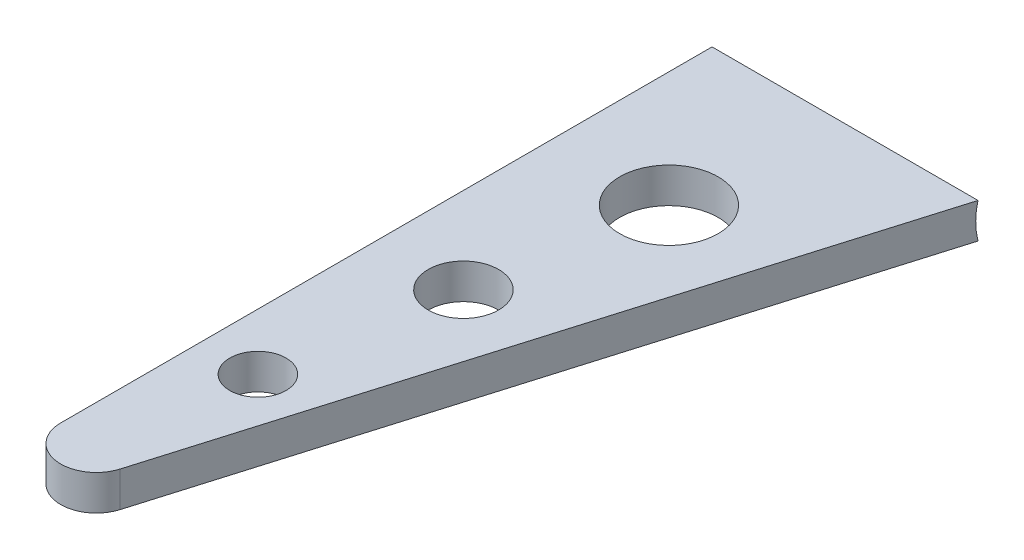
ISO-10303-21;
HEADER;
FILE_DESCRIPTION(('STEP AP214'),'2;1');
FILE_NAME('part.step','',(''),(''),'','','');
FILE_SCHEMA(('AUTOMOTIVE_DESIGN { 1 0 10303 214 1 1 1 1 }'));
ENDSEC;
DATA;
#1=APPLICATION_CONTEXT('core data for automotive mechanical design processes');
#2=APPLICATION_PROTOCOL_DEFINITION('international standard','automotive_design',2000,#1);
#3=PRODUCT_CONTEXT('',#1,'mechanical');
#4=PRODUCT('Part','Part','',(#3));
#5=PRODUCT_RELATED_PRODUCT_CATEGORY('part','',(#4));
#6=PRODUCT_DEFINITION_FORMATION('','',#4);
#7=PRODUCT_DEFINITION_CONTEXT('part definition',#1,'design');
#8=PRODUCT_DEFINITION('design','',#6,#7);
#9=PRODUCT_DEFINITION_SHAPE('','',#8);
#10=(LENGTH_UNIT() NAMED_UNIT(*) SI_UNIT(.MILLI.,.METRE.));
#11=(NAMED_UNIT(*) PLANE_ANGLE_UNIT() SI_UNIT($,.RADIAN.));
#12=(NAMED_UNIT(*) SI_UNIT($,.STERADIAN.) SOLID_ANGLE_UNIT());
#13=UNCERTAINTY_MEASURE_WITH_UNIT(LENGTH_MEASURE(1.E-05),#10,'distance_accuracy_value','');
#14=(GEOMETRIC_REPRESENTATION_CONTEXT(3) GLOBAL_UNCERTAINTY_ASSIGNED_CONTEXT((#13)) GLOBAL_UNIT_ASSIGNED_CONTEXT((#10,
#11,#12)) REPRESENTATION_CONTEXT('',''));
#15=CARTESIAN_POINT('',(0.,0.,0.));
#16=DIRECTION('',(0.,0.,1.));
#17=DIRECTION('',(1.,0.,0.));
#18=AXIS2_PLACEMENT_3D('',#15,#16,#17);
#19=CARTESIAN_POINT('',(5.05247252478177,5.,100.));
#20=DIRECTION('',(0.,1.,0.));
#21=DIRECTION('',(0.,0.,1.));
#22=AXIS2_PLACEMENT_3D('',#19,#20,#21);
#23=PLANE('',#22);
#24=DIRECTION('',(-1.,0.,0.));
#25=VECTOR('',#24,1.);
#26=CARTESIAN_POINT('',(50.,5.,7.45150593301871));
#27=LINE('',#26,#25);
#28=CARTESIAN_POINT('',(0.,5.,7.4515059330187));
#29=VERTEX_POINT('',#28);
#30=CARTESIAN_POINT('',(37.7885976695773,5.,7.45150593301878));
#31=VERTEX_POINT('',#30);
#32=EDGE_CURVE('E55',#29,#31,#27,.F.);
#33=ORIENTED_EDGE('',*,*,#32,.F.);
#34=DIRECTION('',(0.,0.,1.));
#35=VECTOR('',#34,1.);
#36=CARTESIAN_POINT('',(0.,5.,0.));
#37=LINE('',#36,#35);
#38=CARTESIAN_POINT('',(0.,5.,100.));
#39=VERTEX_POINT('',#38);
#40=EDGE_CURVE('E101',#29,#39,#37,.T.);
#41=ORIENTED_EDGE('',*,*,#40,.T.);
#42=CARTESIAN_POINT('',(5.05247252478177,5.,100.));
#43=DIRECTION('',(0.,1.,0.));
#44=DIRECTION('',(0.,0.,1.));
#45=AXIS2_PLACEMENT_3D('',#42,#43,#44);
#46=CIRCLE('',#45,5.05247252478177);
#47=CARTESIAN_POINT('',(9.89614485873125,5.,101.43746893358));
#48=VERTEX_POINT('',#47);
#49=EDGE_CURVE('E63',#39,#48,#46,.T.);
#50=ORIENTED_EDGE('',*,*,#49,.T.);
#51=DIRECTION('',(0.284508015932631,0.,-0.958673661299859));
#52=VECTOR('',#51,1.);
#53=CARTESIAN_POINT('',(9.89614485873125,5.,101.43746893358));
#54=LINE('',#53,#52);
#55=EDGE_CURVE('E92',#48,#31,#54,.T.);
#56=ORIENTED_EDGE('',*,*,#55,.T.);
#57=EDGE_LOOP('',(#33,#41,#50,#56));
#58=FACE_BOUND('',#57,.T.);
#59=CARTESIAN_POINT('',(12.2224434427303,5.,55.));
#60=DIRECTION('',(0.,1.,0.));
#61=DIRECTION('',(0.,0.,1.));
#62=AXIS2_PLACEMENT_3D('',#59,#60,#61);
#63=CIRCLE('',#62,5.);
#64=CARTESIAN_POINT('',(12.2224434427303,5.,60.));
#65=VERTEX_POINT('',#64);
#66=EDGE_CURVE('E124',#65,#65,#63,.T.);
#67=ORIENTED_EDGE('',*,*,#66,.F.);
#68=EDGE_LOOP('',(#67));
#69=FACE_BOUND('',#68,.T.);
#70=CARTESIAN_POINT('',(8.02372850008268,5.,80.));
#71=DIRECTION('',(0.,1.,0.));
#72=DIRECTION('',(0.,0.,1.));
#73=AXIS2_PLACEMENT_3D('',#70,#71,#72);
#74=CIRCLE('',#73,4.00000000000001);
#75=CARTESIAN_POINT('',(8.02372850008268,5.,84.));
#76=VERTEX_POINT('',#75);
#77=EDGE_CURVE('E113',#76,#76,#74,.T.);
#78=ORIENTED_EDGE('',*,*,#77,.F.);
#79=EDGE_LOOP('',(#78));
#80=FACE_BOUND('',#79,.T.);
#81=CARTESIAN_POINT('',(16.421158385378,5.,30.));
#82=DIRECTION('',(0.,1.,0.));
#83=DIRECTION('',(0.,0.,1.));
#84=AXIS2_PLACEMENT_3D('',#81,#82,#83);
#85=CIRCLE('',#84,7.);
#86=CARTESIAN_POINT('',(16.421158385378,5.,37.));
#87=VERTEX_POINT('',#86);
#88=EDGE_CURVE('E130',#87,#87,#85,.T.);
#89=ORIENTED_EDGE('',*,*,#88,.F.);
#90=EDGE_LOOP('',(#89));
#91=FACE_BOUND('',#90,.T.);
#92=ADVANCED_FACE('F39',(#58,#69,#80,#91),#23,.T.);
#93=CARTESIAN_POINT('',(5.05247252478177,0.,100.));
#94=DIRECTION('',(0.,1.,0.));
#95=DIRECTION('',(0.,0.,1.));
#96=AXIS2_PLACEMENT_3D('',#93,#94,#95);
#97=PLANE('',#96);
#98=DIRECTION('',(0.,0.,1.));
#99=VECTOR('',#98,1.);
#100=CARTESIAN_POINT('',(0.,0.,0.));
#101=LINE('',#100,#99);
#102=CARTESIAN_POINT('',(0.,0.,7.4515059330187));
#103=VERTEX_POINT('',#102);
#104=CARTESIAN_POINT('',(0.,0.,100.));
#105=VERTEX_POINT('',#104);
#106=EDGE_CURVE('E87',#103,#105,#101,.T.);
#107=ORIENTED_EDGE('',*,*,#106,.F.);
#108=DIRECTION('',(-1.,0.,0.));
#109=VECTOR('',#108,1.);
#110=CARTESIAN_POINT('',(50.,0.,7.45150593301871));
#111=LINE('',#110,#109);
#112=CARTESIAN_POINT('',(37.7885976695773,0.,7.45150593301878));
#113=VERTEX_POINT('',#112);
#114=EDGE_CURVE('E99',#103,#113,#111,.F.);
#115=ORIENTED_EDGE('',*,*,#114,.T.);
#116=DIRECTION('',(0.284508015932631,0.,-0.958673661299859));
#117=VECTOR('',#116,1.);
#118=CARTESIAN_POINT('',(9.89614485873125,0.,101.43746893358));
#119=LINE('',#118,#117);
#120=CARTESIAN_POINT('',(9.89614485873125,0.,101.43746893358));
#121=VERTEX_POINT('',#120);
#122=EDGE_CURVE('E86',#121,#113,#119,.T.);
#123=ORIENTED_EDGE('',*,*,#122,.F.);
#124=CARTESIAN_POINT('',(5.05247252478177,0.,100.));
#125=DIRECTION('',(0.,1.,0.));
#126=DIRECTION('',(0.,0.,1.));
#127=AXIS2_PLACEMENT_3D('',#124,#125,#126);
#128=CIRCLE('',#127,5.05247252478177);
#129=EDGE_CURVE('E76',#105,#121,#128,.T.);
#130=ORIENTED_EDGE('',*,*,#129,.F.);
#131=EDGE_LOOP('',(#107,#115,#123,#130));
#132=FACE_BOUND('',#131,.T.);
#133=CARTESIAN_POINT('',(8.02372850008268,0.,80.));
#134=DIRECTION('',(0.,1.,0.));
#135=DIRECTION('',(0.,0.,1.));
#136=AXIS2_PLACEMENT_3D('',#133,#134,#135);
#137=CIRCLE('',#136,4.00000000000001);
#138=CARTESIAN_POINT('',(8.02372850008268,0.,84.));
#139=VERTEX_POINT('',#138);
#140=EDGE_CURVE('E118',#139,#139,#137,.T.);
#141=ORIENTED_EDGE('',*,*,#140,.T.);
#142=EDGE_LOOP('',(#141));
#143=FACE_BOUND('',#142,.T.);
#144=CARTESIAN_POINT('',(12.2224434427303,0.,55.));
#145=DIRECTION('',(0.,1.,0.));
#146=DIRECTION('',(0.,0.,1.));
#147=AXIS2_PLACEMENT_3D('',#144,#145,#146);
#148=CIRCLE('',#147,5.);
#149=CARTESIAN_POINT('',(12.2224434427303,0.,60.));
#150=VERTEX_POINT('',#149);
#151=EDGE_CURVE('E126',#150,#150,#148,.T.);
#152=ORIENTED_EDGE('',*,*,#151,.T.);
#153=EDGE_LOOP('',(#152));
#154=FACE_BOUND('',#153,.T.);
#155=CARTESIAN_POINT('',(16.421158385378,0.,30.));
#156=DIRECTION('',(0.,1.,0.));
#157=DIRECTION('',(0.,0.,1.));
#158=AXIS2_PLACEMENT_3D('',#155,#156,#157);
#159=CIRCLE('',#158,7.);
#160=CARTESIAN_POINT('',(16.421158385378,0.,37.));
#161=VERTEX_POINT('',#160);
#162=EDGE_CURVE('E134',#161,#161,#159,.T.);
#163=ORIENTED_EDGE('',*,*,#162,.T.);
#164=EDGE_LOOP('',(#163));
#165=FACE_BOUND('',#164,.T.);
#166=ADVANCED_FACE('F96',(#132,#143,#154,#165),#97,.F.);
#167=CARTESIAN_POINT('',(0.,5.,0.));
#168=DIRECTION('',(1.,0.,0.));
#169=DIRECTION('',(0.,0.,-1.));
#170=AXIS2_PLACEMENT_3D('',#167,#168,#169);
#171=PLANE('',#170);
#172=ORIENTED_EDGE('',*,*,#40,.F.);
#173=CARTESIAN_POINT('',(0.,2.5,-5.));
#174=DIRECTION('',(-1.,0.,0.));
#175=DIRECTION('',(0.,0.,1.));
#176=AXIS2_PLACEMENT_3D('',#173,#174,#175);
#177=CIRCLE('',#176,12.7);
#178=EDGE_CURVE('E145',#103,#29,#177,.T.);
#179=ORIENTED_EDGE('',*,*,#178,.F.);
#180=ORIENTED_EDGE('',*,*,#106,.T.);
#181=DIRECTION('',(0.,-1.,0.));
#182=VECTOR('',#181,1.);
#183=CARTESIAN_POINT('',(0.,5.,100.));
#184=LINE('',#183,#182);
#185=EDGE_CURVE('E48',#39,#105,#184,.T.);
#186=ORIENTED_EDGE('',*,*,#185,.F.);
#187=EDGE_LOOP('',(#172,#179,#180,#186));
#188=FACE_BOUND('',#187,.T.);
#189=ADVANCED_FACE('F41',(#188),#171,.F.);
#190=CARTESIAN_POINT('',(5.05247252478177,5.,100.));
#191=DIRECTION('',(0.,-1.,0.));
#192=DIRECTION('',(0.,0.,-1.));
#193=AXIS2_PLACEMENT_3D('',#190,#191,#192);
#194=CYLINDRICAL_SURFACE('',#193,5.05247252478177);
#195=ORIENTED_EDGE('',*,*,#129,.T.);
#196=DIRECTION('',(0.,-1.,0.));
#197=VECTOR('',#196,1.);
#198=CARTESIAN_POINT('',(9.89614485873125,5.,101.43746893358));
#199=LINE('',#198,#197);
#200=EDGE_CURVE('E79',#48,#121,#199,.T.);
#201=ORIENTED_EDGE('',*,*,#200,.F.);
#202=ORIENTED_EDGE('',*,*,#49,.F.);
#203=ORIENTED_EDGE('',*,*,#185,.T.);
#204=EDGE_LOOP('',(#195,#201,#202,#203));
#205=FACE_BOUND('',#204,.T.);
#206=ADVANCED_FACE('F78',(#205),#194,.T.);
#207=CARTESIAN_POINT('',(9.89614485873125,5.,101.43746893358));
#208=DIRECTION('',(-0.958673661299859,0.,-0.284508015932631));
#209=DIRECTION('',(-0.284508015932631,0.,0.95867366129986));
#210=AXIS2_PLACEMENT_3D('',#207,#208,#209);
#211=PLANE('',#210);
#212=ORIENTED_EDGE('',*,*,#122,.T.);
#213=CARTESIAN_POINT('',(41.4838626918511,2.5,-5.));
#214=DIRECTION('',(-0.958673661299859,0.,-0.284508015932631));
#215=DIRECTION('',(-0.284508015932631,0.,0.95867366129986));
#216=AXIS2_PLACEMENT_3D('',#213,#214,#215);
#217=ELLIPSE('',#216,13.2474694076607,12.7);
#218=EDGE_CURVE('E11',#113,#31,#217,.T.);
#219=ORIENTED_EDGE('',*,*,#218,.T.);
#220=ORIENTED_EDGE('',*,*,#55,.F.);
#221=ORIENTED_EDGE('',*,*,#200,.T.);
#222=EDGE_LOOP('',(#212,#219,#220,#221));
#223=FACE_BOUND('',#222,.T.);
#224=ADVANCED_FACE('F91',(#223),#211,.F.);
#225=CARTESIAN_POINT('',(8.02372850008268,5.,80.));
#226=DIRECTION('',(0.,-1.,0.));
#227=DIRECTION('',(0.,0.,-1.));
#228=AXIS2_PLACEMENT_3D('',#225,#226,#227);
#229=CYLINDRICAL_SURFACE('',#228,4.00000000000001);
#230=ORIENTED_EDGE('',*,*,#77,.T.);
#231=EDGE_LOOP('',(#230));
#232=FACE_BOUND('',#231,.T.);
#233=ORIENTED_EDGE('',*,*,#140,.F.);
#234=EDGE_LOOP('',(#233));
#235=FACE_BOUND('',#234,.T.);
#236=ADVANCED_FACE('F164',(#232,#235),#229,.F.);
#237=CARTESIAN_POINT('',(12.2224434427303,5.,55.));
#238=DIRECTION('',(0.,-1.,0.));
#239=DIRECTION('',(0.,0.,-1.));
#240=AXIS2_PLACEMENT_3D('',#237,#238,#239);
#241=CYLINDRICAL_SURFACE('',#240,5.);
#242=ORIENTED_EDGE('',*,*,#66,.T.);
#243=EDGE_LOOP('',(#242));
#244=FACE_BOUND('',#243,.T.);
#245=ORIENTED_EDGE('',*,*,#151,.F.);
#246=EDGE_LOOP('',(#245));
#247=FACE_BOUND('',#246,.T.);
#248=ADVANCED_FACE('F171',(#244,#247),#241,.F.);
#249=CARTESIAN_POINT('',(16.421158385378,5.,30.));
#250=DIRECTION('',(0.,-1.,0.));
#251=DIRECTION('',(0.,0.,-1.));
#252=AXIS2_PLACEMENT_3D('',#249,#250,#251);
#253=CYLINDRICAL_SURFACE('',#252,7.);
#254=ORIENTED_EDGE('',*,*,#88,.T.);
#255=EDGE_LOOP('',(#254));
#256=FACE_BOUND('',#255,.T.);
#257=ORIENTED_EDGE('',*,*,#162,.F.);
#258=EDGE_LOOP('',(#257));
#259=FACE_BOUND('',#258,.T.);
#260=ADVANCED_FACE('F175',(#256,#259),#253,.F.);
#261=CARTESIAN_POINT('',(50.,2.5,-5.));
#262=DIRECTION('',(-1.,0.,0.));
#263=DIRECTION('',(0.,0.,1.));
#264=AXIS2_PLACEMENT_3D('',#261,#262,#263);
#265=CYLINDRICAL_SURFACE('',#264,12.7);
#266=ORIENTED_EDGE('',*,*,#32,.T.);
#267=ORIENTED_EDGE('',*,*,#218,.F.);
#268=ORIENTED_EDGE('',*,*,#114,.F.);
#269=ORIENTED_EDGE('',*,*,#178,.T.);
#270=EDGE_LOOP('',(#266,#267,#268,#269));
#271=FACE_BOUND('',#270,.T.);
#272=ADVANCED_FACE('F148',(#271),#265,.F.);
#273=CLOSED_SHELL('',(#92,#166,#189,#206,#224,#236,#248,#260,#272));
#274=MANIFOLD_SOLID_BREP('B2',#273);
#275=ADVANCED_BREP_SHAPE_REPRESENTATION('',(#18,#274),#14);
#276=SHAPE_DEFINITION_REPRESENTATION(#9,#275);
ENDSEC;
END-ISO-10303-21;
